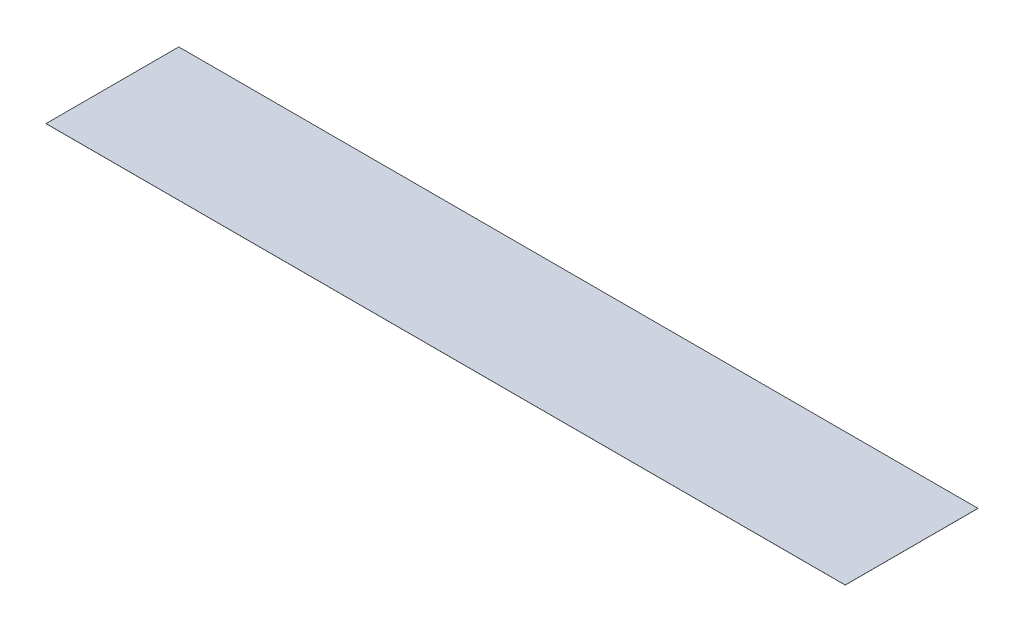
ISO-10303-21;
HEADER;
FILE_DESCRIPTION(('STEP AP214'),'2;1');
FILE_NAME('part.step','',(''),(''),'','','');
FILE_SCHEMA(('AUTOMOTIVE_DESIGN { 1 0 10303 214 1 1 1 1 }'));
ENDSEC;
DATA;
#1=APPLICATION_CONTEXT('core data for automotive mechanical design processes');
#2=APPLICATION_PROTOCOL_DEFINITION('international standard','automotive_design',2000,#1);
#3=PRODUCT_CONTEXT('',#1,'mechanical');
#4=PRODUCT('Part','Part','',(#3));
#5=PRODUCT_RELATED_PRODUCT_CATEGORY('part','',(#4));
#6=PRODUCT_DEFINITION_FORMATION('','',#4);
#7=PRODUCT_DEFINITION_CONTEXT('part definition',#1,'design');
#8=PRODUCT_DEFINITION('design','',#6,#7);
#9=PRODUCT_DEFINITION_SHAPE('','',#8);
#10=(LENGTH_UNIT() NAMED_UNIT(*) SI_UNIT(.MILLI.,.METRE.));
#11=(NAMED_UNIT(*) PLANE_ANGLE_UNIT() SI_UNIT($,.RADIAN.));
#12=(NAMED_UNIT(*) SI_UNIT($,.STERADIAN.) SOLID_ANGLE_UNIT());
#13=UNCERTAINTY_MEASURE_WITH_UNIT(LENGTH_MEASURE(1.E-05),#10,'distance_accuracy_value','');
#14=(GEOMETRIC_REPRESENTATION_CONTEXT(3) GLOBAL_UNCERTAINTY_ASSIGNED_CONTEXT((#13)) GLOBAL_UNIT_ASSIGNED_CONTEXT((#10,
#11,#12)) REPRESENTATION_CONTEXT('',''));
#15=CARTESIAN_POINT('',(0.,0.,0.));
#16=DIRECTION('',(0.,0.,1.));
#17=DIRECTION('',(1.,0.,0.));
#18=AXIS2_PLACEMENT_3D('',#15,#16,#17);
#19=CARTESIAN_POINT('',(-1714.31676099467,0.01,-276.904977976065));
#20=DIRECTION('',(1.,0.,-3.66373598126213E-13));
#21=DIRECTION('',(-3.66373598126213E-13,0.,-1.));
#22=AXIS2_PLACEMENT_3D('',#19,#20,#21);
#23=PLANE('',#22);
#24=DIRECTION('',(3.66373598126213E-13,0.,1.));
#25=VECTOR('',#24,1.);
#26=CARTESIAN_POINT('',(-1714.31676099467,0.,-276.904977976065));
#27=LINE('',#26,#25);
#28=CARTESIAN_POINT('',(-1714.31676099467,0.,-276.904977976065));
#29=VERTEX_POINT('',#28);
#30=CARTESIAN_POINT('',(-1714.31676099466,0.,-256.90497797606));
#31=VERTEX_POINT('',#30);
#32=EDGE_CURVE('E110',#29,#31,#27,.T.);
#33=ORIENTED_EDGE('',*,*,#32,.F.);
#34=DIRECTION('',(0.,-1.,0.));
#35=VECTOR('',#34,1.);
#36=CARTESIAN_POINT('',(-1714.31676099467,0.01,-276.904977976065));
#37=LINE('',#36,#35);
#38=CARTESIAN_POINT('',(-1714.31676099467,0.01,-276.904977976065));
#39=VERTEX_POINT('',#38);
#40=EDGE_CURVE('E11',#39,#29,#37,.T.);
#41=ORIENTED_EDGE('',*,*,#40,.F.);
#42=DIRECTION('',(3.66373598126213E-13,0.,1.));
#43=VECTOR('',#42,1.);
#44=CARTESIAN_POINT('',(-1714.31676099467,0.01,-276.904977976065));
#45=LINE('',#44,#43);
#46=CARTESIAN_POINT('',(-1714.31676099466,0.01,-256.90497797606));
#47=VERTEX_POINT('',#46);
#48=EDGE_CURVE('E103',#39,#47,#45,.T.);
#49=ORIENTED_EDGE('',*,*,#48,.T.);
#50=DIRECTION('',(0.,-1.,0.));
#51=VECTOR('',#50,1.);
#52=CARTESIAN_POINT('',(-1714.31676099466,0.01,-256.90497797606));
#53=LINE('',#52,#51);
#54=EDGE_CURVE('E42',#47,#31,#53,.T.);
#55=ORIENTED_EDGE('',*,*,#54,.T.);
#56=EDGE_LOOP('',(#33,#41,#49,#55));
#57=FACE_BOUND('',#56,.T.);
#58=ADVANCED_FACE('F39',(#57),#23,.T.);
#59=CARTESIAN_POINT('',(-1714.31676099467,0.01,-276.904977976065));
#60=DIRECTION('',(0.,0.,1.));
#61=DIRECTION('',(1.,0.,0.));
#62=AXIS2_PLACEMENT_3D('',#59,#60,#61);
#63=PLANE('',#62);
#64=DIRECTION('',(-1.,0.,0.));
#65=VECTOR('',#64,1.);
#66=CARTESIAN_POINT('',(-1714.31676099467,0.,-276.904977976065));
#67=LINE('',#66,#65);
#68=CARTESIAN_POINT('',(-1834.70027204081,0.,-276.904977976066));
#69=VERTEX_POINT('',#68);
#70=EDGE_CURVE('E73',#29,#69,#67,.T.);
#71=ORIENTED_EDGE('',*,*,#70,.T.);
#72=DIRECTION('',(0.,-1.,0.));
#73=VECTOR('',#72,1.);
#74=CARTESIAN_POINT('',(-1834.70027204081,0.01,-276.904977976066));
#75=LINE('',#74,#73);
#76=CARTESIAN_POINT('',(-1834.70027204081,0.01,-276.904977976066));
#77=VERTEX_POINT('',#76);
#78=EDGE_CURVE('E49',#77,#69,#75,.T.);
#79=ORIENTED_EDGE('',*,*,#78,.F.);
#80=DIRECTION('',(-1.,0.,0.));
#81=VECTOR('',#80,1.);
#82=CARTESIAN_POINT('',(-1714.31676099467,0.01,-276.904977976065));
#83=LINE('',#82,#81);
#84=EDGE_CURVE('E90',#39,#77,#83,.T.);
#85=ORIENTED_EDGE('',*,*,#84,.F.);
#86=ORIENTED_EDGE('',*,*,#40,.T.);
#87=EDGE_LOOP('',(#71,#79,#85,#86));
#88=FACE_BOUND('',#87,.T.);
#89=ADVANCED_FACE('F126',(#88),#63,.F.);
#90=CARTESIAN_POINT('',(-1834.70027204081,0.01,-276.904977976066));
#91=DIRECTION('',(1.,0.,0.));
#92=DIRECTION('',(0.,0.,-1.));
#93=AXIS2_PLACEMENT_3D('',#90,#91,#92);
#94=PLANE('',#93);
#95=DIRECTION('',(0.,0.,1.));
#96=VECTOR('',#95,1.);
#97=CARTESIAN_POINT('',(-1834.70027204081,0.,-276.904977976066));
#98=LINE('',#97,#96);
#99=CARTESIAN_POINT('',(-1834.70027204081,0.,-256.90497797606));
#100=VERTEX_POINT('',#99);
#101=EDGE_CURVE('E98',#69,#100,#98,.T.);
#102=ORIENTED_EDGE('',*,*,#101,.T.);
#103=DIRECTION('',(0.,-1.,0.));
#104=VECTOR('',#103,1.);
#105=CARTESIAN_POINT('',(-1834.70027204081,0.01,-256.90497797606));
#106=LINE('',#105,#104);
#107=CARTESIAN_POINT('',(-1834.70027204081,0.01,-256.90497797606));
#108=VERTEX_POINT('',#107);
#109=EDGE_CURVE('E95',#108,#100,#106,.T.);
#110=ORIENTED_EDGE('',*,*,#109,.F.);
#111=DIRECTION('',(0.,0.,1.));
#112=VECTOR('',#111,1.);
#113=CARTESIAN_POINT('',(-1834.70027204081,0.01,-276.904977976066));
#114=LINE('',#113,#112);
#115=EDGE_CURVE('E85',#77,#108,#114,.T.);
#116=ORIENTED_EDGE('',*,*,#115,.F.);
#117=ORIENTED_EDGE('',*,*,#78,.T.);
#118=EDGE_LOOP('',(#102,#110,#116,#117));
#119=FACE_BOUND('',#118,.T.);
#120=ADVANCED_FACE('F96',(#119),#94,.F.);
#121=CARTESIAN_POINT('',(-1714.31676099466,0.01,-256.90497797606));
#122=DIRECTION('',(0.,0.,1.));
#123=DIRECTION('',(1.,0.,0.));
#124=AXIS2_PLACEMENT_3D('',#121,#122,#123);
#125=PLANE('',#124);
#126=DIRECTION('',(-1.,0.,0.));
#127=VECTOR('',#126,1.);
#128=CARTESIAN_POINT('',(-1714.31676099466,0.,-256.90497797606));
#129=LINE('',#128,#127);
#130=EDGE_CURVE('E114',#31,#100,#129,.T.);
#131=ORIENTED_EDGE('',*,*,#130,.F.);
#132=ORIENTED_EDGE('',*,*,#54,.F.);
#133=DIRECTION('',(-1.,0.,0.));
#134=VECTOR('',#133,1.);
#135=CARTESIAN_POINT('',(-1714.31676099466,0.01,-256.90497797606));
#136=LINE('',#135,#134);
#137=EDGE_CURVE('E89',#47,#108,#136,.T.);
#138=ORIENTED_EDGE('',*,*,#137,.T.);
#139=ORIENTED_EDGE('',*,*,#109,.T.);
#140=EDGE_LOOP('',(#131,#132,#138,#139));
#141=FACE_BOUND('',#140,.T.);
#142=ADVANCED_FACE('F101',(#141),#125,.T.);
#143=CARTESIAN_POINT('',(0.,0.01,0.));
#144=DIRECTION('',(0.,-1.,0.));
#145=DIRECTION('',(0.,0.,-1.));
#146=AXIS2_PLACEMENT_3D('',#143,#144,#145);
#147=PLANE('',#146);
#148=ORIENTED_EDGE('',*,*,#48,.F.);
#149=ORIENTED_EDGE('',*,*,#84,.T.);
#150=ORIENTED_EDGE('',*,*,#115,.T.);
#151=ORIENTED_EDGE('',*,*,#137,.F.);
#152=EDGE_LOOP('',(#148,#149,#150,#151));
#153=FACE_BOUND('',#152,.T.);
#154=ADVANCED_FACE('F88',(#153),#147,.F.);
#155=CARTESIAN_POINT('',(0.,0.,0.));
#156=DIRECTION('',(0.,-1.,0.));
#157=DIRECTION('',(0.,0.,-1.));
#158=AXIS2_PLACEMENT_3D('',#155,#156,#157);
#159=PLANE('',#158);
#160=ORIENTED_EDGE('',*,*,#32,.T.);
#161=ORIENTED_EDGE('',*,*,#130,.T.);
#162=ORIENTED_EDGE('',*,*,#101,.F.);
#163=ORIENTED_EDGE('',*,*,#70,.F.);
#164=EDGE_LOOP('',(#160,#161,#162,#163));
#165=FACE_BOUND('',#164,.T.);
#166=ADVANCED_FACE('F123',(#165),#159,.T.);
#167=CLOSED_SHELL('',(#58,#89,#120,#142,#154,#166));
#168=MANIFOLD_SOLID_BREP('B2',#167);
#169=ADVANCED_BREP_SHAPE_REPRESENTATION('',(#18,#168),#14);
#170=SHAPE_DEFINITION_REPRESENTATION(#9,#169);
ENDSEC;
END-ISO-10303-21;
